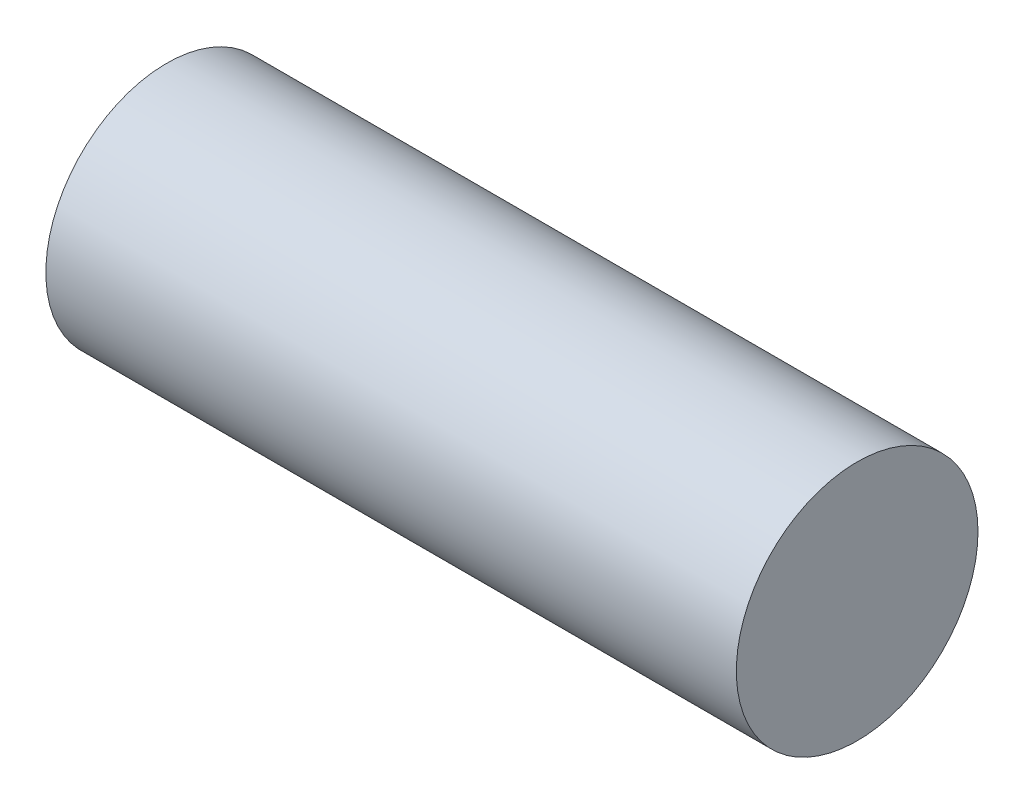
ISO-10303-21;
HEADER;
FILE_DESCRIPTION(('STEP AP214'),'2;1');
FILE_NAME('part.step','',(''),(''),'','','');
FILE_SCHEMA(('AUTOMOTIVE_DESIGN { 1 0 10303 214 1 1 1 1 }'));
ENDSEC;
DATA;
#1=APPLICATION_CONTEXT('core data for automotive mechanical design processes');
#2=APPLICATION_PROTOCOL_DEFINITION('international standard','automotive_design',2000,#1);
#3=PRODUCT_CONTEXT('',#1,'mechanical');
#4=PRODUCT('Part','Part','',(#3));
#5=PRODUCT_RELATED_PRODUCT_CATEGORY('part','',(#4));
#6=PRODUCT_DEFINITION_FORMATION('','',#4);
#7=PRODUCT_DEFINITION_CONTEXT('part definition',#1,'design');
#8=PRODUCT_DEFINITION('design','',#6,#7);
#9=PRODUCT_DEFINITION_SHAPE('','',#8);
#10=(LENGTH_UNIT() NAMED_UNIT(*) SI_UNIT(.MILLI.,.METRE.));
#11=(NAMED_UNIT(*) PLANE_ANGLE_UNIT() SI_UNIT($,.RADIAN.));
#12=(NAMED_UNIT(*) SI_UNIT($,.STERADIAN.) SOLID_ANGLE_UNIT());
#13=UNCERTAINTY_MEASURE_WITH_UNIT(LENGTH_MEASURE(1.E-05),#10,'distance_accuracy_value','');
#14=(GEOMETRIC_REPRESENTATION_CONTEXT(3) GLOBAL_UNCERTAINTY_ASSIGNED_CONTEXT((#13)) GLOBAL_UNIT_ASSIGNED_CONTEXT((#10,
#11,#12)) REPRESENTATION_CONTEXT('',''));
#15=CARTESIAN_POINT('',(0.,0.,0.));
#16=DIRECTION('',(0.,0.,1.));
#17=DIRECTION('',(1.,0.,0.));
#18=AXIS2_PLACEMENT_3D('',#15,#16,#17);
#19=CARTESIAN_POINT('',(58.7,-80.6,0.));
#20=DIRECTION('',(1.,0.,0.));
#21=DIRECTION('',(0.,0.,1.));
#22=AXIS2_PLACEMENT_3D('',#19,#20,#21);
#23=PLANE('',#22);
#24=CARTESIAN_POINT('',(58.7,-80.6,0.));
#25=DIRECTION('',(-1.,0.,0.));
#26=DIRECTION('',(0.,0.,-1.));
#27=AXIS2_PLACEMENT_3D('',#24,#25,#26);
#28=CIRCLE('',#27,3.5);
#29=CARTESIAN_POINT('',(58.7,-80.6,-3.5));
#30=VERTEX_POINT('',#29);
#31=EDGE_CURVE('E23',#30,#30,#28,.T.);
#32=ORIENTED_EDGE('',*,*,#31,.T.);
#33=EDGE_LOOP('',(#32));
#34=FACE_BOUND('',#33,.T.);
#35=ADVANCED_FACE('F14',(#34),#23,.F.);
#36=CARTESIAN_POINT('',(78.7,-80.6,0.));
#37=DIRECTION('',(1.,0.,0.));
#38=DIRECTION('',(0.,0.,1.));
#39=AXIS2_PLACEMENT_3D('',#36,#37,#38);
#40=PLANE('',#39);
#41=CARTESIAN_POINT('',(78.7,-80.6,0.));
#42=DIRECTION('',(-1.,0.,0.));
#43=DIRECTION('',(0.,0.,-1.));
#44=AXIS2_PLACEMENT_3D('',#41,#42,#43);
#45=CIRCLE('',#44,3.5);
#46=CARTESIAN_POINT('',(78.7,-80.6,-3.5));
#47=VERTEX_POINT('',#46);
#48=EDGE_CURVE('E9',#47,#47,#45,.T.);
#49=ORIENTED_EDGE('',*,*,#48,.F.);
#50=EDGE_LOOP('',(#49));
#51=FACE_BOUND('',#50,.T.);
#52=ADVANCED_FACE('F46',(#51),#40,.T.);
#53=CARTESIAN_POINT('',(58.7,-80.6,0.));
#54=DIRECTION('',(1.,0.,0.));
#55=DIRECTION('',(0.,0.,-1.));
#56=AXIS2_PLACEMENT_3D('',#53,#54,#55);
#57=CYLINDRICAL_SURFACE('',#56,3.5);
#58=DIRECTION('',(1.,0.,0.));
#59=VECTOR('',#58,1.);
#60=CARTESIAN_POINT('',(58.7,-80.6,-3.5));
#61=LINE('',#60,#59);
#62=EDGE_CURVE('E40',#30,#47,#61,.T.);
#63=ORIENTED_EDGE('',*,*,#62,.F.);
#64=ORIENTED_EDGE('',*,*,#31,.F.);
#65=ORIENTED_EDGE('',*,*,#62,.T.);
#66=ORIENTED_EDGE('',*,*,#48,.T.);
#67=EDGE_LOOP('',(#63,#64,#65,#66));
#68=FACE_BOUND('',#67,.T.);
#69=ADVANCED_FACE('F16',(#68),#57,.T.);
#70=CLOSED_SHELL('',(#35,#52,#69));
#71=MANIFOLD_SOLID_BREP('B1',#70);
#72=ADVANCED_BREP_SHAPE_REPRESENTATION('',(#18,#71),#14);
#73=SHAPE_DEFINITION_REPRESENTATION(#9,#72);
ENDSEC;
END-ISO-10303-21;
